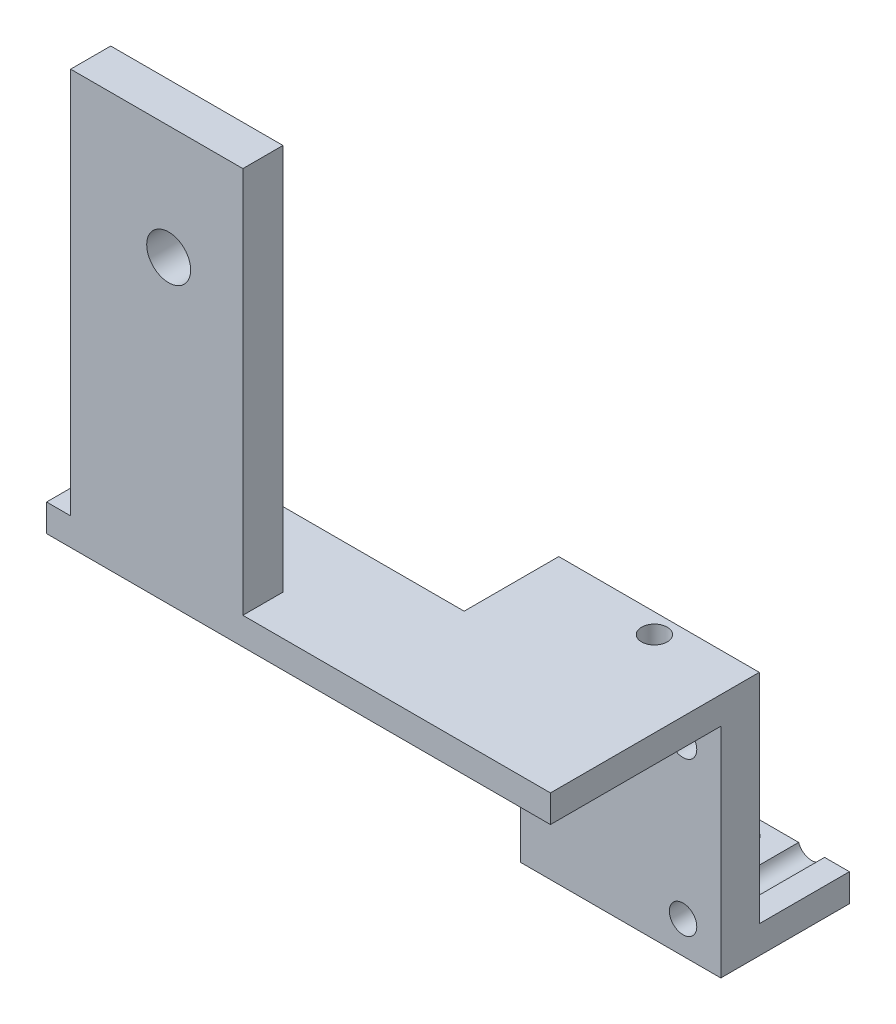
ISO-10303-21;
HEADER;
FILE_DESCRIPTION(('STEP AP214'),'2;1');
FILE_NAME('part.step','',(''),(''),'','','');
FILE_SCHEMA(('AUTOMOTIVE_DESIGN { 1 0 10303 214 1 1 1 1 }'));
ENDSEC;
DATA;
#1=APPLICATION_CONTEXT('core data for automotive mechanical design processes');
#2=APPLICATION_PROTOCOL_DEFINITION('international standard','automotive_design',2000,#1);
#3=PRODUCT_CONTEXT('',#1,'mechanical');
#4=PRODUCT('Part','Part','',(#3));
#5=PRODUCT_RELATED_PRODUCT_CATEGORY('part','',(#4));
#6=PRODUCT_DEFINITION_FORMATION('','',#4);
#7=PRODUCT_DEFINITION_CONTEXT('part definition',#1,'design');
#8=PRODUCT_DEFINITION('design','',#6,#7);
#9=PRODUCT_DEFINITION_SHAPE('','',#8);
#10=(LENGTH_UNIT() NAMED_UNIT(*) SI_UNIT(.MILLI.,.METRE.));
#11=(NAMED_UNIT(*) PLANE_ANGLE_UNIT() SI_UNIT($,.RADIAN.));
#12=(NAMED_UNIT(*) SI_UNIT($,.STERADIAN.) SOLID_ANGLE_UNIT());
#13=UNCERTAINTY_MEASURE_WITH_UNIT(LENGTH_MEASURE(1.E-05),#10,'distance_accuracy_value','');
#14=(GEOMETRIC_REPRESENTATION_CONTEXT(3) GLOBAL_UNCERTAINTY_ASSIGNED_CONTEXT((#13)) GLOBAL_UNIT_ASSIGNED_CONTEXT((#10,
#11,#12)) REPRESENTATION_CONTEXT('',''));
#15=CARTESIAN_POINT('',(0.,0.,0.));
#16=DIRECTION('',(0.,0.,1.));
#17=DIRECTION('',(1.,0.,0.));
#18=AXIS2_PLACEMENT_3D('',#15,#16,#17);
#19=CARTESIAN_POINT('',(0.,28.5900042065279,4.445));
#20=DIRECTION('',(0.,-1.,0.));
#21=DIRECTION('',(0.,0.,-1.));
#22=AXIS2_PLACEMENT_3D('',#19,#20,#21);
#23=PLANE('',#22);
#24=CARTESIAN_POINT('',(8.69659583607098,28.5900042065279,2.27649901293459));
#25=DIRECTION('',(0.,-1.,0.));
#26=DIRECTION('',(0.,0.,-1.));
#27=AXIS2_PLACEMENT_3D('',#24,#25,#26);
#28=CIRCLE('',#27,1.48238000670044);
#29=CARTESIAN_POINT('',(8.69659583607098,28.5900042065279,0.794119006234143));
#30=VERTEX_POINT('',#29);
#31=EDGE_CURVE('E305',#30,#30,#28,.T.);
#32=ORIENTED_EDGE('',*,*,#31,.T.);
#33=EDGE_LOOP('',(#32));
#34=FACE_BOUND('',#33,.T.);
#35=DIRECTION('',(0.,0.,1.));
#36=VECTOR('',#35,1.);
#37=CARTESIAN_POINT('',(-36.9062674109368,28.5900042065279,19.4974990131453));
#38=LINE('',#37,#36);
#39=CARTESIAN_POINT('',(-36.9062674109368,28.5900042065279,19.4974990131453));
#40=VERTEX_POINT('',#39);
#41=CARTESIAN_POINT('',(-36.9062674109368,28.5900042065279,24.13));
#42=VERTEX_POINT('',#41);
#43=EDGE_CURVE('E54',#40,#42,#38,.T.);
#44=ORIENTED_EDGE('',*,*,#43,.F.);
#45=DIRECTION('',(-1.,0.,0.));
#46=VECTOR('',#45,1.);
#47=CARTESIAN_POINT('',(-17.0053615995187,28.5900042065279,19.4974990131453));
#48=LINE('',#47,#46);
#49=CARTESIAN_POINT('',(-17.0053615995187,28.5900042065279,19.4974990131453));
#50=VERTEX_POINT('',#49);
#51=EDGE_CURVE('E330',#50,#40,#48,.T.);
#52=ORIENTED_EDGE('',*,*,#51,.F.);
#53=DIRECTION('',(0.,0.,-1.));
#54=VECTOR('',#53,1.);
#55=CARTESIAN_POINT('',(-17.0053615995187,28.5900042065279,24.13));
#56=LINE('',#55,#54);
#57=CARTESIAN_POINT('',(-17.0053615995187,28.5900042065279,24.13));
#58=VERTEX_POINT('',#57);
#59=EDGE_CURVE('E323',#58,#50,#56,.T.);
#60=ORIENTED_EDGE('',*,*,#59,.F.);
#61=DIRECTION('',(-1.,0.,0.));
#62=VECTOR('',#61,1.);
#63=CARTESIAN_POINT('',(0.,28.5900042065279,24.13));
#64=LINE('',#63,#62);
#65=CARTESIAN_POINT('',(18.5390230235645,28.5900042065279,24.13));
#66=VERTEX_POINT('',#65);
#67=EDGE_CURVE('E187',#66,#58,#64,.T.);
#68=ORIENTED_EDGE('',*,*,#67,.F.);
#69=DIRECTION('',(0.,0.,-1.));
#70=VECTOR('',#69,1.);
#71=CARTESIAN_POINT('',(18.5390230235645,28.5900042065279,4.445));
#72=LINE('',#71,#70);
#73=CARTESIAN_POINT('',(18.5390230235645,28.5900042065279,0.));
#74=VERTEX_POINT('',#73);
#75=EDGE_CURVE('E46',#66,#74,#72,.T.);
#76=ORIENTED_EDGE('',*,*,#75,.T.);
#77=DIRECTION('',(-1.,0.,0.));
#78=VECTOR('',#77,1.);
#79=CARTESIAN_POINT('',(0.,28.5900042065279,0.));
#80=LINE('',#79,#78);
#81=CARTESIAN_POINT('',(-4.63302055204196,28.5900042065279,0.));
#82=VERTEX_POINT('',#81);
#83=EDGE_CURVE('E279',#74,#82,#80,.T.);
#84=ORIENTED_EDGE('',*,*,#83,.T.);
#85=DIRECTION('',(0.,0.,-1.));
#86=VECTOR('',#85,1.);
#87=CARTESIAN_POINT('',(-4.63302055204196,28.5900042065279,4.445));
#88=LINE('',#87,#86);
#89=CARTESIAN_POINT('',(-4.63302055204196,28.5900042065279,10.9334271635255));
#90=VERTEX_POINT('',#89);
#91=EDGE_CURVE('E296',#90,#82,#88,.T.);
#92=ORIENTED_EDGE('',*,*,#91,.F.);
#93=DIRECTION('',(1.,0.,0.));
#94=VECTOR('',#93,1.);
#95=CARTESIAN_POINT('',(-39.685020552042,28.5900042065279,10.9334271635255));
#96=LINE('',#95,#94);
#97=CARTESIAN_POINT('',(-39.685020552042,28.5900042065279,10.9334271635255));
#98=VERTEX_POINT('',#97);
#99=EDGE_CURVE('E208',#98,#90,#96,.T.);
#100=ORIENTED_EDGE('',*,*,#99,.F.);
#101=DIRECTION('',(0.,0.,-1.));
#102=VECTOR('',#101,1.);
#103=CARTESIAN_POINT('',(-39.685020552042,28.5900042065279,10.9334271635255));
#104=LINE('',#103,#102);
#105=CARTESIAN_POINT('',(-39.685020552042,28.5900042065279,24.13));
#106=VERTEX_POINT('',#105);
#107=EDGE_CURVE('E201',#106,#98,#104,.T.);
#108=ORIENTED_EDGE('',*,*,#107,.F.);
#109=EDGE_CURVE('E59',#42,#106,#64,.T.);
#110=ORIENTED_EDGE('',*,*,#109,.F.);
#111=EDGE_LOOP('',(#44,#52,#60,#68,#76,#84,#92,#100,#108,#110));
#112=FACE_BOUND('',#111,.T.);
#113=ADVANCED_FACE('F37',(#34,#112),#23,.F.);
#114=CARTESIAN_POINT('',(-4.63302055204196,0.,4.445));
#115=DIRECTION('',(-1.,0.,0.));
#116=DIRECTION('',(0.,0.,1.));
#117=AXIS2_PLACEMENT_3D('',#114,#115,#116);
#118=PLANE('',#117);
#119=DIRECTION('',(0.,0.,-1.));
#120=VECTOR('',#119,1.);
#121=CARTESIAN_POINT('',(-4.63302055204196,25.4209597706919,24.13));
#122=LINE('',#121,#120);
#123=CARTESIAN_POINT('',(-4.63302055204196,25.4209597706919,10.9334271635255));
#124=VERTEX_POINT('',#123);
#125=CARTESIAN_POINT('',(-4.63302055204196,25.4209597706919,4.445));
#126=VERTEX_POINT('',#125);
#127=EDGE_CURVE('E218',#124,#126,#122,.T.);
#128=ORIENTED_EDGE('',*,*,#127,.F.);
#129=DIRECTION('',(0.,-1.,0.));
#130=VECTOR('',#129,1.);
#131=CARTESIAN_POINT('',(-4.63302055204196,25.4209597706919,10.9334271635255));
#132=LINE('',#131,#130);
#133=EDGE_CURVE('E188',#90,#124,#132,.T.);
#134=ORIENTED_EDGE('',*,*,#133,.F.);
#135=ORIENTED_EDGE('',*,*,#91,.T.);
#136=DIRECTION('',(0.,1.,0.));
#137=VECTOR('',#136,1.);
#138=CARTESIAN_POINT('',(-4.63302055204196,0.,0.));
#139=LINE('',#138,#137);
#140=CARTESIAN_POINT('',(-4.63302055204196,14.3598739416565,0.));
#141=VERTEX_POINT('',#140);
#142=EDGE_CURVE('E282',#141,#82,#139,.T.);
#143=ORIENTED_EDGE('',*,*,#142,.F.);
#144=DIRECTION('',(0.,0.,-1.));
#145=VECTOR('',#144,1.);
#146=CARTESIAN_POINT('',(-4.63302055204196,14.3598739416565,4.445));
#147=LINE('',#146,#145);
#148=CARTESIAN_POINT('',(-4.63302055204196,14.3598739416565,4.445));
#149=VERTEX_POINT('',#148);
#150=EDGE_CURVE('E294',#149,#141,#147,.T.);
#151=ORIENTED_EDGE('',*,*,#150,.F.);
#152=DIRECTION('',(0.,1.,0.));
#153=VECTOR('',#152,1.);
#154=CARTESIAN_POINT('',(-4.63302055204196,0.,4.445));
#155=LINE('',#154,#153);
#156=EDGE_CURVE('E263',#149,#126,#155,.T.);
#157=ORIENTED_EDGE('',*,*,#156,.T.);
#158=EDGE_LOOP('',(#128,#134,#135,#143,#151,#157));
#159=FACE_BOUND('',#158,.T.);
#160=ADVANCED_FACE('F358',(#159),#118,.T.);
#161=CARTESIAN_POINT('',(0.,0.,4.445));
#162=DIRECTION('',(0.,0.,1.));
#163=DIRECTION('',(1.,0.,0.));
#164=AXIS2_PLACEMENT_3D('',#161,#162,#163);
#165=PLANE('',#164);
#166=CARTESIAN_POINT('',(14.1730335684273,3.95795977069188,4.445));
#167=DIRECTION('',(0.,0.,1.));
#168=DIRECTION('',(1.,0.,0.));
#169=AXIS2_PLACEMENT_3D('',#166,#167,#168);
#170=CIRCLE('',#169,1.5875);
#171=CARTESIAN_POINT('',(15.7605335684273,3.95795977069188,4.445));
#172=VERTEX_POINT('',#171);
#173=EDGE_CURVE('E253',#172,#172,#170,.T.);
#174=ORIENTED_EDGE('',*,*,#173,.F.);
#175=EDGE_LOOP('',(#174));
#176=FACE_BOUND('',#175,.T.);
#177=CARTESIAN_POINT('',(14.1730335684273,21.6871597706919,4.445));
#178=DIRECTION('',(0.,0.,1.));
#179=DIRECTION('',(1.,0.,0.));
#180=AXIS2_PLACEMENT_3D('',#177,#178,#179);
#181=CIRCLE('',#180,1.5875);
#182=CARTESIAN_POINT('',(15.7605335684273,21.6871597706919,4.445));
#183=VERTEX_POINT('',#182);
#184=EDGE_CURVE('E256',#183,#183,#181,.T.);
#185=ORIENTED_EDGE('',*,*,#184,.F.);
#186=EDGE_LOOP('',(#185));
#187=FACE_BOUND('',#186,.T.);
#188=DIRECTION('',(0.,1.,0.));
#189=VECTOR('',#188,1.);
#190=CARTESIAN_POINT('',(18.5390230235645,0.,4.445));
#191=LINE('',#190,#189);
#192=CARTESIAN_POINT('',(18.5390230235645,0.22415977069187,4.445));
#193=VERTEX_POINT('',#192);
#194=CARTESIAN_POINT('',(18.5390230235645,25.4209597706919,4.445));
#195=VERTEX_POINT('',#194);
#196=EDGE_CURVE('E260',#193,#195,#191,.T.);
#197=ORIENTED_EDGE('',*,*,#196,.T.);
#198=DIRECTION('',(-1.,0.,0.));
#199=VECTOR('',#198,1.);
#200=CARTESIAN_POINT('',(0.,25.4209597706919,4.445));
#201=LINE('',#200,#199);
#202=EDGE_CURVE('E11',#195,#126,#201,.T.);
#203=ORIENTED_EDGE('',*,*,#202,.T.);
#204=ORIENTED_EDGE('',*,*,#156,.F.);
#205=CARTESIAN_POINT('',(-6.65496643157269,12.8225597706919,4.445));
#206=DIRECTION('',(0.,0.,1.));
#207=DIRECTION('',(1.,0.,0.));
#208=AXIS2_PLACEMENT_3D('',#205,#206,#207);
#209=CIRCLE('',#208,2.54);
#210=CARTESIAN_POINT('',(-4.63302055204196,11.2852455997272,4.445));
#211=VERTEX_POINT('',#210);
#212=EDGE_CURVE('E266',#211,#149,#209,.T.);
#213=ORIENTED_EDGE('',*,*,#212,.F.);
#214=CARTESIAN_POINT('',(-4.63302055204196,0.22415977069187,4.445));
#215=VERTEX_POINT('',#214);
#216=EDGE_CURVE('E267',#215,#211,#155,.T.);
#217=ORIENTED_EDGE('',*,*,#216,.F.);
#218=DIRECTION('',(1.,0.,0.));
#219=VECTOR('',#218,1.);
#220=CARTESIAN_POINT('',(0.,0.22415977069187,4.445));
#221=LINE('',#220,#219);
#222=EDGE_CURVE('E270',#215,#193,#221,.T.);
#223=ORIENTED_EDGE('',*,*,#222,.T.);
#224=EDGE_LOOP('',(#197,#203,#204,#213,#217,#223));
#225=FACE_BOUND('',#224,.T.);
#226=ADVANCED_FACE('F381',(#176,#187,#225),#165,.T.);
#227=CARTESIAN_POINT('',(0.,0.,0.));
#228=DIRECTION('',(0.,0.,1.));
#229=DIRECTION('',(1.,0.,0.));
#230=AXIS2_PLACEMENT_3D('',#227,#228,#229);
#231=PLANE('',#230);
#232=ORIENTED_EDGE('',*,*,#83,.F.);
#233=DIRECTION('',(0.,1.,0.));
#234=VECTOR('',#233,1.);
#235=CARTESIAN_POINT('',(18.5390230235645,0.,0.));
#236=LINE('',#235,#234);
#237=CARTESIAN_POINT('',(18.5390230235645,3.43369585866854,0.));
#238=VERTEX_POINT('',#237);
#239=EDGE_CURVE('E277',#238,#74,#236,.T.);
#240=ORIENTED_EDGE('',*,*,#239,.F.);
#241=DIRECTION('',(1.,0.,0.));
#242=VECTOR('',#241,1.);
#243=CARTESIAN_POINT('',(18.5390230235645,3.43369585866854,0.));
#244=LINE('',#243,#242);
#245=CARTESIAN_POINT('',(15.6714672841952,3.43369585866854,0.));
#246=VERTEX_POINT('',#245);
#247=EDGE_CURVE('E225',#246,#238,#244,.T.);
#248=ORIENTED_EDGE('',*,*,#247,.F.);
#249=CARTESIAN_POINT('',(14.1730335684273,3.95795977069188,0.));
#250=DIRECTION('',(0.,0.,1.));
#251=DIRECTION('',(1.,0.,0.));
#252=AXIS2_PLACEMENT_3D('',#249,#250,#251);
#253=CIRCLE('',#252,1.5875);
#254=CARTESIAN_POINT('',(12.6745998526594,3.43369585866854,0.));
#255=VERTEX_POINT('',#254);
#256=EDGE_CURVE('E252',#246,#255,#253,.T.);
#257=ORIENTED_EDGE('',*,*,#256,.T.);
#258=DIRECTION('',(1.,0.,0.));
#259=VECTOR('',#258,1.);
#260=CARTESIAN_POINT('',(-4.63302055204196,3.43369585866854,0.));
#261=LINE('',#260,#259);
#262=CARTESIAN_POINT('',(-4.63302055204196,3.43369585866854,0.));
#263=VERTEX_POINT('',#262);
#264=EDGE_CURVE('E220',#263,#255,#261,.T.);
#265=ORIENTED_EDGE('',*,*,#264,.F.);
#266=CARTESIAN_POINT('',(-4.63302055204196,11.2852455997272,0.));
#267=VERTEX_POINT('',#266);
#268=EDGE_CURVE('E257',#263,#267,#139,.T.);
#269=ORIENTED_EDGE('',*,*,#268,.T.);
#270=CARTESIAN_POINT('',(-6.65496643157269,12.8225597706919,0.));
#271=DIRECTION('',(0.,0.,1.));
#272=DIRECTION('',(1.,0.,0.));
#273=AXIS2_PLACEMENT_3D('',#270,#271,#272);
#274=CIRCLE('',#273,2.54);
#275=EDGE_CURVE('E285',#267,#141,#274,.T.);
#276=ORIENTED_EDGE('',*,*,#275,.T.);
#277=ORIENTED_EDGE('',*,*,#142,.T.);
#278=EDGE_LOOP('',(#232,#240,#248,#257,#265,#269,#276,#277));
#279=FACE_BOUND('',#278,.T.);
#280=CARTESIAN_POINT('',(14.1730335684273,21.6871597706919,0.));
#281=DIRECTION('',(0.,0.,1.));
#282=DIRECTION('',(1.,0.,0.));
#283=AXIS2_PLACEMENT_3D('',#280,#281,#282);
#284=CIRCLE('',#283,1.5875);
#285=CARTESIAN_POINT('',(15.7605335684273,21.6871597706919,0.));
#286=VERTEX_POINT('',#285);
#287=EDGE_CURVE('E274',#286,#286,#284,.T.);
#288=ORIENTED_EDGE('',*,*,#287,.T.);
#289=EDGE_LOOP('',(#288));
#290=FACE_BOUND('',#289,.T.);
#291=ADVANCED_FACE('F349',(#279,#290),#231,.F.);
#292=CARTESIAN_POINT('',(18.5390230235645,0.,4.445));
#293=DIRECTION('',(-1.,0.,0.));
#294=DIRECTION('',(0.,0.,1.));
#295=AXIS2_PLACEMENT_3D('',#292,#293,#294);
#296=PLANE('',#295);
#297=ORIENTED_EDGE('',*,*,#75,.F.);
#298=DIRECTION('',(0.,1.,0.));
#299=VECTOR('',#298,1.);
#300=CARTESIAN_POINT('',(18.5390230235645,0.,24.13));
#301=LINE('',#300,#299);
#302=CARTESIAN_POINT('',(18.5390230235645,25.4209597706919,24.13));
#303=VERTEX_POINT('',#302);
#304=EDGE_CURVE('E210',#303,#66,#301,.T.);
#305=ORIENTED_EDGE('',*,*,#304,.F.);
#306=DIRECTION('',(0.,0.,-1.));
#307=VECTOR('',#306,1.);
#308=CARTESIAN_POINT('',(18.5390230235645,25.4209597706919,24.13));
#309=LINE('',#308,#307);
#310=EDGE_CURVE('E215',#303,#195,#309,.T.);
#311=ORIENTED_EDGE('',*,*,#310,.T.);
#312=ORIENTED_EDGE('',*,*,#196,.F.);
#313=DIRECTION('',(0.,0.,-1.));
#314=VECTOR('',#313,1.);
#315=CARTESIAN_POINT('',(18.5390230235645,0.22415977069187,4.445));
#316=LINE('',#315,#314);
#317=CARTESIAN_POINT('',(18.5390230235645,0.22415977069187,-10.414));
#318=VERTEX_POINT('',#317);
#319=EDGE_CURVE('E272',#193,#318,#316,.T.);
#320=ORIENTED_EDGE('',*,*,#319,.T.);
#321=DIRECTION('',(0.,-1.,0.));
#322=VECTOR('',#321,1.);
#323=CARTESIAN_POINT('',(18.5390230235645,3.43369585866854,-10.414));
#324=LINE('',#323,#322);
#325=CARTESIAN_POINT('',(18.5390230235645,3.43369585866854,-10.414));
#326=VERTEX_POINT('',#325);
#327=EDGE_CURVE('E221',#326,#318,#324,.T.);
#328=ORIENTED_EDGE('',*,*,#327,.F.);
#329=DIRECTION('',(0.,0.,1.));
#330=VECTOR('',#329,1.);
#331=CARTESIAN_POINT('',(18.5390230235645,3.43369585866854,-10.414));
#332=LINE('',#331,#330);
#333=EDGE_CURVE('E236',#326,#238,#332,.T.);
#334=ORIENTED_EDGE('',*,*,#333,.T.);
#335=ORIENTED_EDGE('',*,*,#239,.T.);
#336=EDGE_LOOP('',(#297,#305,#311,#312,#320,#328,#334,#335));
#337=FACE_BOUND('',#336,.T.);
#338=ADVANCED_FACE('F343',(#337),#296,.F.);
#339=CARTESIAN_POINT('',(-6.65496643157269,12.8225597706919,4.445));
#340=DIRECTION('',(0.,0.,-1.));
#341=DIRECTION('',(-1.,0.,0.));
#342=AXIS2_PLACEMENT_3D('',#339,#340,#341);
#343=CYLINDRICAL_SURFACE('',#342,2.54);
#344=ORIENTED_EDGE('',*,*,#275,.F.);
#345=DIRECTION('',(0.,0.,-1.));
#346=VECTOR('',#345,1.);
#347=CARTESIAN_POINT('',(-4.63302055204196,11.2852455997272,4.445));
#348=LINE('',#347,#346);
#349=EDGE_CURVE('E291',#211,#267,#348,.T.);
#350=ORIENTED_EDGE('',*,*,#349,.F.);
#351=ORIENTED_EDGE('',*,*,#212,.T.);
#352=ORIENTED_EDGE('',*,*,#150,.T.);
#353=EDGE_LOOP('',(#344,#350,#351,#352));
#354=FACE_BOUND('',#353,.T.);
#355=ADVANCED_FACE('F386',(#354),#343,.F.);
#356=ORIENTED_EDGE('',*,*,#268,.F.);
#357=DIRECTION('',(0.,0.,1.));
#358=VECTOR('',#357,1.);
#359=CARTESIAN_POINT('',(-4.63302055204196,3.43369585866854,-10.414));
#360=LINE('',#359,#358);
#361=CARTESIAN_POINT('',(-4.63302055204196,3.43369585866854,-10.414));
#362=VERTEX_POINT('',#361);
#363=EDGE_CURVE('E249',#362,#263,#360,.T.);
#364=ORIENTED_EDGE('',*,*,#363,.F.);
#365=DIRECTION('',(0.,1.,0.));
#366=VECTOR('',#365,1.);
#367=CARTESIAN_POINT('',(-4.63302055204196,0.22415977069187,-10.414));
#368=LINE('',#367,#366);
#369=CARTESIAN_POINT('',(-4.63302055204196,0.22415977069187,-10.414));
#370=VERTEX_POINT('',#369);
#371=EDGE_CURVE('E228',#370,#362,#368,.T.);
#372=ORIENTED_EDGE('',*,*,#371,.F.);
#373=DIRECTION('',(0.,0.,-1.));
#374=VECTOR('',#373,1.);
#375=CARTESIAN_POINT('',(-4.63302055204196,0.22415977069187,4.445));
#376=LINE('',#375,#374);
#377=EDGE_CURVE('E289',#215,#370,#376,.T.);
#378=ORIENTED_EDGE('',*,*,#377,.F.);
#379=ORIENTED_EDGE('',*,*,#216,.T.);
#380=ORIENTED_EDGE('',*,*,#349,.T.);
#381=EDGE_LOOP('',(#356,#364,#372,#378,#379,#380));
#382=FACE_BOUND('',#381,.T.);
#383=ADVANCED_FACE('F383',(#382),#118,.T.);
#384=CARTESIAN_POINT('',(14.1730335684273,21.6871597706919,4.445));
#385=DIRECTION('',(0.,0.,-1.));
#386=DIRECTION('',(-1.,0.,0.));
#387=AXIS2_PLACEMENT_3D('',#384,#385,#386);
#388=CYLINDRICAL_SURFACE('',#387,1.5875);
#389=ORIENTED_EDGE('',*,*,#184,.T.);
#390=EDGE_LOOP('',(#389));
#391=FACE_BOUND('',#390,.T.);
#392=ORIENTED_EDGE('',*,*,#287,.F.);
#393=EDGE_LOOP('',(#392));
#394=FACE_BOUND('',#393,.T.);
#395=ADVANCED_FACE('F388',(#391,#394),#388,.F.);
#396=CARTESIAN_POINT('',(14.1730335684273,3.95795977069188,4.445));
#397=DIRECTION('',(0.,0.,-1.));
#398=DIRECTION('',(-1.,0.,0.));
#399=AXIS2_PLACEMENT_3D('',#396,#397,#398);
#400=CYLINDRICAL_SURFACE('',#399,1.5875);
#401=ORIENTED_EDGE('',*,*,#173,.T.);
#402=EDGE_LOOP('',(#401));
#403=FACE_BOUND('',#402,.T.);
#404=ORIENTED_EDGE('',*,*,#256,.F.);
#405=DIRECTION('',(0.,0.,1.));
#406=VECTOR('',#405,1.);
#407=CARTESIAN_POINT('',(15.6714672841952,3.43369585866854,-10.414));
#408=LINE('',#407,#406);
#409=CARTESIAN_POINT('',(15.6714672841952,3.43369585866854,-10.414));
#410=VERTEX_POINT('',#409);
#411=EDGE_CURVE('E243',#410,#246,#408,.T.);
#412=ORIENTED_EDGE('',*,*,#411,.F.);
#413=CARTESIAN_POINT('',(14.1730335684273,3.95795977069188,-10.414));
#414=DIRECTION('',(0.,0.,1.));
#415=DIRECTION('',(-1.,0.,0.));
#416=AXIS2_PLACEMENT_3D('',#413,#414,#415);
#417=CIRCLE('',#416,1.5875);
#418=CARTESIAN_POINT('',(12.6745998526594,3.43369585866854,-10.414));
#419=VERTEX_POINT('',#418);
#420=EDGE_CURVE('E232',#419,#410,#417,.T.);
#421=ORIENTED_EDGE('',*,*,#420,.F.);
#422=DIRECTION('',(0.,0.,1.));
#423=VECTOR('',#422,1.);
#424=CARTESIAN_POINT('',(12.6745998526594,3.43369585866854,-10.414));
#425=LINE('',#424,#423);
#426=EDGE_CURVE('E246',#419,#255,#425,.T.);
#427=ORIENTED_EDGE('',*,*,#426,.T.);
#428=EDGE_LOOP('',(#404,#412,#421,#427));
#429=FACE_BOUND('',#428,.T.);
#430=ADVANCED_FACE('F39',(#403,#429),#400,.F.);
#431=CARTESIAN_POINT('',(0.,0.22415977069187,4.445));
#432=DIRECTION('',(0.,1.,0.));
#433=DIRECTION('',(0.,0.,1.));
#434=AXIS2_PLACEMENT_3D('',#431,#432,#433);
#435=PLANE('',#434);
#436=CARTESIAN_POINT('',(-0.15296716231581,0.22415977069187,-2.7247931364563));
#437=DIRECTION('',(0.,-1.,0.));
#438=DIRECTION('',(0.,0.,-1.));
#439=AXIS2_PLACEMENT_3D('',#436,#437,#438);
#440=CIRCLE('',#439,1.99489234781879);
#441=CARTESIAN_POINT('',(-0.15296716231581,0.22415977069187,-4.71968548427509));
#442=VERTEX_POINT('',#441);
#443=EDGE_CURVE('E301',#442,#442,#440,.T.);
#444=ORIENTED_EDGE('',*,*,#443,.F.);
#445=EDGE_LOOP('',(#444));
#446=FACE_BOUND('',#445,.T.);
#447=CARTESIAN_POINT('',(8.69659583607098,0.22415977069187,2.27649901293459));
#448=DIRECTION('',(0.,-1.,0.));
#449=DIRECTION('',(0.,0.,-1.));
#450=AXIS2_PLACEMENT_3D('',#447,#448,#449);
#451=CIRCLE('',#450,1.48238000670044);
#452=CARTESIAN_POINT('',(8.69659583607098,0.22415977069187,0.794119006234143));
#453=VERTEX_POINT('',#452);
#454=EDGE_CURVE('E307',#453,#453,#451,.T.);
#455=ORIENTED_EDGE('',*,*,#454,.F.);
#456=EDGE_LOOP('',(#455));
#457=FACE_BOUND('',#456,.T.);
#458=CARTESIAN_POINT('',(8.69659583607112,0.22415977069187,-7.7235009870654));
#459=DIRECTION('',(0.,-1.,0.));
#460=DIRECTION('',(0.,0.,-1.));
#461=AXIS2_PLACEMENT_3D('',#458,#459,#460);
#462=CIRCLE('',#461,1.56095940784157);
#463=CARTESIAN_POINT('',(8.69659583607112,0.22415977069187,-9.28446039490697));
#464=VERTEX_POINT('',#463);
#465=EDGE_CURVE('E312',#464,#464,#462,.T.);
#466=ORIENTED_EDGE('',*,*,#465,.F.);
#467=EDGE_LOOP('',(#466));
#468=FACE_BOUND('',#467,.T.);
#469=ORIENTED_EDGE('',*,*,#377,.T.);
#470=DIRECTION('',(-1.,0.,0.));
#471=VECTOR('',#470,1.);
#472=CARTESIAN_POINT('',(18.5390230235645,0.22415977069187,-10.414));
#473=LINE('',#472,#471);
#474=EDGE_CURVE('E224',#318,#370,#473,.T.);
#475=ORIENTED_EDGE('',*,*,#474,.F.);
#476=ORIENTED_EDGE('',*,*,#319,.F.);
#477=ORIENTED_EDGE('',*,*,#222,.F.);
#478=EDGE_LOOP('',(#469,#475,#476,#477));
#479=FACE_BOUND('',#478,.T.);
#480=ADVANCED_FACE('F395',(#446,#457,#468,#479),#435,.F.);
#481=CARTESIAN_POINT('',(-4.63302055204196,3.43369585866854,-10.414));
#482=DIRECTION('',(0.,-1.,0.));
#483=DIRECTION('',(1.,0.,0.));
#484=AXIS2_PLACEMENT_3D('',#481,#482,#483);
#485=PLANE('',#484);
#486=CARTESIAN_POINT('',(-0.15296716231581,3.43369585866854,-2.7247931364563));
#487=DIRECTION('',(0.,-1.,0.));
#488=DIRECTION('',(1.,0.,0.));
#489=AXIS2_PLACEMENT_3D('',#486,#487,#488);
#490=CIRCLE('',#489,1.99489234781879);
#491=CARTESIAN_POINT('',(1.84192518550298,3.43369585866854,-2.7247931364563));
#492=VERTEX_POINT('',#491);
#493=EDGE_CURVE('E41',#492,#492,#490,.T.);
#494=ORIENTED_EDGE('',*,*,#493,.T.);
#495=EDGE_LOOP('',(#494));
#496=FACE_BOUND('',#495,.T.);
#497=CARTESIAN_POINT('',(8.69659583607112,3.43369585866854,-7.7235009870654));
#498=DIRECTION('',(0.,-1.,0.));
#499=DIRECTION('',(1.,0.,0.));
#500=AXIS2_PLACEMENT_3D('',#497,#498,#499);
#501=CIRCLE('',#500,1.56095940784157);
#502=CARTESIAN_POINT('',(10.2575552439127,3.43369585866854,-7.7235009870654));
#503=VERTEX_POINT('',#502);
#504=EDGE_CURVE('E299',#503,#503,#501,.T.);
#505=ORIENTED_EDGE('',*,*,#504,.T.);
#506=EDGE_LOOP('',(#505));
#507=FACE_BOUND('',#506,.T.);
#508=ORIENTED_EDGE('',*,*,#264,.T.);
#509=ORIENTED_EDGE('',*,*,#426,.F.);
#510=DIRECTION('',(1.,0.,0.));
#511=VECTOR('',#510,1.);
#512=CARTESIAN_POINT('',(-4.63302055204196,3.43369585866854,-10.414));
#513=LINE('',#512,#511);
#514=EDGE_CURVE('E230',#362,#419,#513,.T.);
#515=ORIENTED_EDGE('',*,*,#514,.F.);
#516=ORIENTED_EDGE('',*,*,#363,.T.);
#517=EDGE_LOOP('',(#508,#509,#515,#516));
#518=FACE_BOUND('',#517,.T.);
#519=ADVANCED_FACE('F411',(#496,#507,#518),#485,.F.);
#520=CARTESIAN_POINT('',(18.5390230235645,3.43369585866854,-10.414));
#521=DIRECTION('',(0.,-1.,0.));
#522=DIRECTION('',(0.,0.,-1.));
#523=AXIS2_PLACEMENT_3D('',#520,#521,#522);
#524=PLANE('',#523);
#525=ORIENTED_EDGE('',*,*,#247,.T.);
#526=ORIENTED_EDGE('',*,*,#333,.F.);
#527=DIRECTION('',(1.,0.,0.));
#528=VECTOR('',#527,1.);
#529=CARTESIAN_POINT('',(18.5390230235645,3.43369585866854,-10.414));
#530=LINE('',#529,#528);
#531=EDGE_CURVE('E234',#410,#326,#530,.T.);
#532=ORIENTED_EDGE('',*,*,#531,.F.);
#533=ORIENTED_EDGE('',*,*,#411,.T.);
#534=EDGE_LOOP('',(#525,#526,#532,#533));
#535=FACE_BOUND('',#534,.T.);
#536=ADVANCED_FACE('F416',(#535),#524,.F.);
#537=CARTESIAN_POINT('',(14.1730335684273,3.95795977069188,-10.414));
#538=DIRECTION('',(0.,0.,-1.));
#539=DIRECTION('',(-1.,0.,0.));
#540=AXIS2_PLACEMENT_3D('',#537,#538,#539);
#541=PLANE('',#540);
#542=ORIENTED_EDGE('',*,*,#327,.T.);
#543=ORIENTED_EDGE('',*,*,#474,.T.);
#544=ORIENTED_EDGE('',*,*,#371,.T.);
#545=ORIENTED_EDGE('',*,*,#514,.T.);
#546=ORIENTED_EDGE('',*,*,#420,.T.);
#547=ORIENTED_EDGE('',*,*,#531,.T.);
#548=EDGE_LOOP('',(#542,#543,#544,#545,#546,#547));
#549=FACE_BOUND('',#548,.T.);
#550=ADVANCED_FACE('F430',(#549),#541,.T.);
#551=CARTESIAN_POINT('',(0.,25.4209597706919,24.13));
#552=DIRECTION('',(0.,1.,0.));
#553=DIRECTION('',(0.,0.,1.));
#554=AXIS2_PLACEMENT_3D('',#551,#552,#553);
#555=PLANE('',#554);
#556=ORIENTED_EDGE('',*,*,#202,.F.);
#557=ORIENTED_EDGE('',*,*,#310,.F.);
#558=DIRECTION('',(1.,0.,0.));
#559=VECTOR('',#558,1.);
#560=CARTESIAN_POINT('',(0.,25.4209597706919,24.13));
#561=LINE('',#560,#559);
#562=CARTESIAN_POINT('',(-39.685020552042,25.4209597706919,24.13));
#563=VERTEX_POINT('',#562);
#564=EDGE_CURVE('E213',#563,#303,#561,.T.);
#565=ORIENTED_EDGE('',*,*,#564,.F.);
#566=DIRECTION('',(0.,0.,1.));
#567=VECTOR('',#566,1.);
#568=CARTESIAN_POINT('',(-39.685020552042,25.4209597706919,24.13));
#569=LINE('',#568,#567);
#570=CARTESIAN_POINT('',(-39.685020552042,25.4209597706919,10.9334271635255));
#571=VERTEX_POINT('',#570);
#572=EDGE_CURVE('E190',#571,#563,#569,.T.);
#573=ORIENTED_EDGE('',*,*,#572,.F.);
#574=DIRECTION('',(1.,0.,0.));
#575=VECTOR('',#574,1.);
#576=CARTESIAN_POINT('',(-39.685020552042,25.4209597706919,10.9334271635255));
#577=LINE('',#576,#575);
#578=EDGE_CURVE('E204',#571,#124,#577,.T.);
#579=ORIENTED_EDGE('',*,*,#578,.T.);
#580=ORIENTED_EDGE('',*,*,#127,.T.);
#581=EDGE_LOOP('',(#556,#557,#565,#573,#579,#580));
#582=FACE_BOUND('',#581,.T.);
#583=ADVANCED_FACE('F364',(#582),#555,.F.);
#584=CARTESIAN_POINT('',(0.,0.,24.13));
#585=DIRECTION('',(0.,0.,1.));
#586=DIRECTION('',(1.,0.,0.));
#587=AXIS2_PLACEMENT_3D('',#584,#585,#586);
#588=PLANE('',#587);
#589=CARTESIAN_POINT('',(-25.5769902147292,60.1257674246914,24.1300000000004));
#590=DIRECTION('',(0.,0.,-1.));
#591=DIRECTION('',(-1.,0.,0.));
#592=AXIS2_PLACEMENT_3D('',#589,#590,#591);
#593=CIRCLE('',#592,2.54);
#594=CARTESIAN_POINT('',(-28.1169902147292,60.1257674246914,24.1300000000003));
#595=VERTEX_POINT('',#594);
#596=EDGE_CURVE('E320',#595,#595,#593,.T.);
#597=ORIENTED_EDGE('',*,*,#596,.T.);
#598=EDGE_LOOP('',(#597));
#599=FACE_BOUND('',#598,.T.);
#600=ORIENTED_EDGE('',*,*,#304,.T.);
#601=ORIENTED_EDGE('',*,*,#67,.T.);
#602=DIRECTION('',(0.,-1.,0.));
#603=VECTOR('',#602,1.);
#604=CARTESIAN_POINT('',(-17.0053615995187,73.2940042065279,24.13));
#605=LINE('',#604,#603);
#606=CARTESIAN_POINT('',(-17.0053615995187,73.2940042065279,24.13));
#607=VERTEX_POINT('',#606);
#608=EDGE_CURVE('E167',#607,#58,#605,.T.);
#609=ORIENTED_EDGE('',*,*,#608,.F.);
#610=DIRECTION('',(1.,0.,0.));
#611=VECTOR('',#610,1.);
#612=CARTESIAN_POINT('',(-36.9062674109368,73.2940042065279,24.13));
#613=LINE('',#612,#611);
#614=CARTESIAN_POINT('',(-36.9062674109368,73.2940042065279,24.13));
#615=VERTEX_POINT('',#614);
#616=EDGE_CURVE('E173',#615,#607,#613,.T.);
#617=ORIENTED_EDGE('',*,*,#616,.F.);
#618=DIRECTION('',(0.,-1.,0.));
#619=VECTOR('',#618,1.);
#620=CARTESIAN_POINT('',(-36.9062674109368,73.2940042065279,24.13));
#621=LINE('',#620,#619);
#622=EDGE_CURVE('E328',#615,#42,#621,.T.);
#623=ORIENTED_EDGE('',*,*,#622,.T.);
#624=ORIENTED_EDGE('',*,*,#109,.T.);
#625=DIRECTION('',(0.,1.,0.));
#626=VECTOR('',#625,1.);
#627=CARTESIAN_POINT('',(-39.685020552042,28.5900042065279,24.13));
#628=LINE('',#627,#626);
#629=EDGE_CURVE('E198',#563,#106,#628,.T.);
#630=ORIENTED_EDGE('',*,*,#629,.F.);
#631=ORIENTED_EDGE('',*,*,#564,.T.);
#632=EDGE_LOOP('',(#600,#601,#609,#617,#623,#624,#630,#631));
#633=FACE_BOUND('',#632,.T.);
#634=ADVANCED_FACE('F185',(#599,#633),#588,.T.);
#635=CARTESIAN_POINT('',(-39.685020552042,25.4209597706919,10.9334271635255));
#636=DIRECTION('',(0.,0.,1.));
#637=DIRECTION('',(1.,0.,0.));
#638=AXIS2_PLACEMENT_3D('',#635,#636,#637);
#639=PLANE('',#638);
#640=ORIENTED_EDGE('',*,*,#133,.T.);
#641=ORIENTED_EDGE('',*,*,#578,.F.);
#642=DIRECTION('',(0.,-1.,0.));
#643=VECTOR('',#642,1.);
#644=CARTESIAN_POINT('',(-39.685020552042,25.4209597706919,10.9334271635255));
#645=LINE('',#644,#643);
#646=EDGE_CURVE('E203',#98,#571,#645,.T.);
#647=ORIENTED_EDGE('',*,*,#646,.F.);
#648=ORIENTED_EDGE('',*,*,#99,.T.);
#649=EDGE_LOOP('',(#640,#641,#647,#648));
#650=FACE_BOUND('',#649,.T.);
#651=ADVANCED_FACE('F361',(#650),#639,.F.);
#652=CARTESIAN_POINT('',(-39.685020552042,0.,0.));
#653=DIRECTION('',(1.,0.,0.));
#654=DIRECTION('',(0.,0.,-1.));
#655=AXIS2_PLACEMENT_3D('',#652,#653,#654);
#656=PLANE('',#655);
#657=ORIENTED_EDGE('',*,*,#572,.T.);
#658=ORIENTED_EDGE('',*,*,#629,.T.);
#659=ORIENTED_EDGE('',*,*,#107,.T.);
#660=ORIENTED_EDGE('',*,*,#646,.T.);
#661=EDGE_LOOP('',(#657,#658,#659,#660));
#662=FACE_BOUND('',#661,.T.);
#663=ADVANCED_FACE('F366',(#662),#656,.F.);
#664=CARTESIAN_POINT('',(-17.0053615995187,73.2940042065279,24.13));
#665=DIRECTION('',(-1.,0.,0.));
#666=DIRECTION('',(0.,0.,1.));
#667=AXIS2_PLACEMENT_3D('',#664,#665,#666);
#668=PLANE('',#667);
#669=ORIENTED_EDGE('',*,*,#59,.T.);
#670=DIRECTION('',(0.,-1.,0.));
#671=VECTOR('',#670,1.);
#672=CARTESIAN_POINT('',(-17.0053615995187,73.2940042065279,19.4974990131453));
#673=LINE('',#672,#671);
#674=CARTESIAN_POINT('',(-17.0053615995187,73.2940042065279,19.4974990131453));
#675=VERTEX_POINT('',#674);
#676=EDGE_CURVE('E169',#675,#50,#673,.T.);
#677=ORIENTED_EDGE('',*,*,#676,.F.);
#678=DIRECTION('',(0.,0.,-1.));
#679=VECTOR('',#678,1.);
#680=CARTESIAN_POINT('',(-17.0053615995187,73.2940042065279,24.13));
#681=LINE('',#680,#679);
#682=EDGE_CURVE('E162',#607,#675,#681,.T.);
#683=ORIENTED_EDGE('',*,*,#682,.F.);
#684=ORIENTED_EDGE('',*,*,#608,.T.);
#685=EDGE_LOOP('',(#669,#677,#683,#684));
#686=FACE_BOUND('',#685,.T.);
#687=ADVANCED_FACE('F165',(#686),#668,.F.);
#688=CARTESIAN_POINT('',(-17.0053615995187,73.2940042065279,19.4974990131453));
#689=DIRECTION('',(0.,0.,1.));
#690=DIRECTION('',(1.,0.,0.));
#691=AXIS2_PLACEMENT_3D('',#688,#689,#690);
#692=PLANE('',#691);
#693=CARTESIAN_POINT('',(-25.5769902147291,60.1257674246914,19.4974990131446));
#694=DIRECTION('',(0.,0.,-1.));
#695=DIRECTION('',(-1.,0.,0.));
#696=AXIS2_PLACEMENT_3D('',#693,#694,#695);
#697=CIRCLE('',#696,2.54);
#698=CARTESIAN_POINT('',(-28.1169902147291,60.1257674246914,19.4974990131445));
#699=VERTEX_POINT('',#698);
#700=EDGE_CURVE('E319',#699,#699,#697,.T.);
#701=ORIENTED_EDGE('',*,*,#700,.F.);
#702=EDGE_LOOP('',(#701));
#703=FACE_BOUND('',#702,.T.);
#704=ORIENTED_EDGE('',*,*,#51,.T.);
#705=DIRECTION('',(0.,-1.,0.));
#706=VECTOR('',#705,1.);
#707=CARTESIAN_POINT('',(-36.9062674109368,73.2940042065279,19.4974990131453));
#708=LINE('',#707,#706);
#709=CARTESIAN_POINT('',(-36.9062674109368,73.2940042065279,19.4974990131453));
#710=VERTEX_POINT('',#709);
#711=EDGE_CURVE('E192',#710,#40,#708,.T.);
#712=ORIENTED_EDGE('',*,*,#711,.F.);
#713=DIRECTION('',(-1.,0.,0.));
#714=VECTOR('',#713,1.);
#715=CARTESIAN_POINT('',(-17.0053615995187,73.2940042065279,19.4974990131453));
#716=LINE('',#715,#714);
#717=EDGE_CURVE('E172',#675,#710,#716,.T.);
#718=ORIENTED_EDGE('',*,*,#717,.F.);
#719=ORIENTED_EDGE('',*,*,#676,.T.);
#720=EDGE_LOOP('',(#704,#712,#718,#719));
#721=FACE_BOUND('',#720,.T.);
#722=ADVANCED_FACE('F338',(#703,#721),#692,.F.);
#723=CARTESIAN_POINT('',(-36.9062674109368,73.2940042065279,19.4974990131453));
#724=DIRECTION('',(1.,0.,0.));
#725=DIRECTION('',(0.,0.,-1.));
#726=AXIS2_PLACEMENT_3D('',#723,#724,#725);
#727=PLANE('',#726);
#728=ORIENTED_EDGE('',*,*,#43,.T.);
#729=ORIENTED_EDGE('',*,*,#622,.F.);
#730=DIRECTION('',(0.,0.,1.));
#731=VECTOR('',#730,1.);
#732=CARTESIAN_POINT('',(-36.9062674109368,73.2940042065279,19.4974990131453));
#733=LINE('',#732,#731);
#734=EDGE_CURVE('E178',#710,#615,#733,.T.);
#735=ORIENTED_EDGE('',*,*,#734,.F.);
#736=ORIENTED_EDGE('',*,*,#711,.T.);
#737=EDGE_LOOP('',(#728,#729,#735,#736));
#738=FACE_BOUND('',#737,.T.);
#739=ADVANCED_FACE('F336',(#738),#727,.F.);
#740=CARTESIAN_POINT('',(0.,73.2940042065279,0.));
#741=DIRECTION('',(0.,1.,0.));
#742=DIRECTION('',(0.,0.,1.));
#743=AXIS2_PLACEMENT_3D('',#740,#741,#742);
#744=PLANE('',#743);
#745=ORIENTED_EDGE('',*,*,#616,.T.);
#746=ORIENTED_EDGE('',*,*,#682,.T.);
#747=ORIENTED_EDGE('',*,*,#717,.T.);
#748=ORIENTED_EDGE('',*,*,#734,.T.);
#749=EDGE_LOOP('',(#745,#746,#747,#748));
#750=FACE_BOUND('',#749,.T.);
#751=ADVANCED_FACE('F176',(#750),#744,.T.);
#752=CARTESIAN_POINT('',(-25.5769902147292,60.1257674246914,24.1300000000004));
#753=DIRECTION('',(0.,0.,-1.));
#754=DIRECTION('',(-1.,0.,0.));
#755=AXIS2_PLACEMENT_3D('',#752,#753,#754);
#756=CYLINDRICAL_SURFACE('',#755,2.54);
#757=ORIENTED_EDGE('',*,*,#596,.F.);
#758=EDGE_LOOP('',(#757));
#759=FACE_BOUND('',#758,.T.);
#760=ORIENTED_EDGE('',*,*,#700,.T.);
#761=EDGE_LOOP('',(#760));
#762=FACE_BOUND('',#761,.T.);
#763=ADVANCED_FACE('F557',(#759,#762),#756,.F.);
#764=CARTESIAN_POINT('',(8.69659583607112,73.2940042065279,-7.7235009870654));
#765=DIRECTION('',(0.,-1.,0.));
#766=DIRECTION('',(0.,0.,-1.));
#767=AXIS2_PLACEMENT_3D('',#764,#765,#766);
#768=CYLINDRICAL_SURFACE('',#767,1.56095940784157);
#769=ORIENTED_EDGE('',*,*,#465,.T.);
#770=EDGE_LOOP('',(#769));
#771=FACE_BOUND('',#770,.T.);
#772=ORIENTED_EDGE('',*,*,#504,.F.);
#773=EDGE_LOOP('',(#772));
#774=FACE_BOUND('',#773,.T.);
#775=ADVANCED_FACE('F580',(#771,#774),#768,.F.);
#776=CARTESIAN_POINT('',(-0.15296716231581,73.2940042065279,-2.7247931364563));
#777=DIRECTION('',(0.,-1.,0.));
#778=DIRECTION('',(0.,0.,-1.));
#779=AXIS2_PLACEMENT_3D('',#776,#777,#778);
#780=CYLINDRICAL_SURFACE('',#779,1.99489234781879);
#781=ORIENTED_EDGE('',*,*,#443,.T.);
#782=EDGE_LOOP('',(#781));
#783=FACE_BOUND('',#782,.T.);
#784=ORIENTED_EDGE('',*,*,#493,.F.);
#785=EDGE_LOOP('',(#784));
#786=FACE_BOUND('',#785,.T.);
#787=ADVANCED_FACE('F604',(#783,#786),#780,.F.);
#788=CARTESIAN_POINT('',(8.69659583607098,73.2940042065279,2.27649901293459));
#789=DIRECTION('',(0.,-1.,0.));
#790=DIRECTION('',(0.,0.,-1.));
#791=AXIS2_PLACEMENT_3D('',#788,#789,#790);
#792=CYLINDRICAL_SURFACE('',#791,1.48238000670044);
#793=ORIENTED_EDGE('',*,*,#454,.T.);
#794=EDGE_LOOP('',(#793));
#795=FACE_BOUND('',#794,.T.);
#796=ORIENTED_EDGE('',*,*,#31,.F.);
#797=EDGE_LOOP('',(#796));
#798=FACE_BOUND('',#797,.T.);
#799=ADVANCED_FACE('F614',(#795,#798),#792,.F.);
#800=CLOSED_SHELL('',(#113,#160,#226,#291,#338,#355,#383,#395,#430,#480,#519,#536,#550,#583,
#634,#651,#663,#687,#722,#739,#751,#763,#775,#787,#799));
#801=MANIFOLD_SOLID_BREP('B2',#800);
#802=ADVANCED_BREP_SHAPE_REPRESENTATION('',(#18,#801),#14);
#803=SHAPE_DEFINITION_REPRESENTATION(#9,#802);
ENDSEC;
END-ISO-10303-21;
